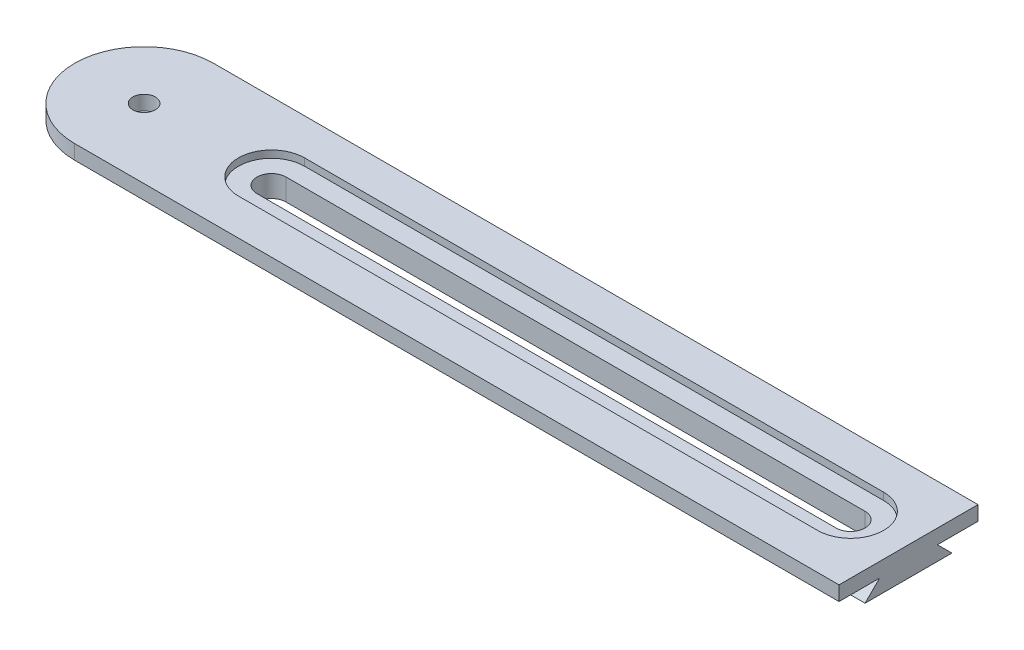
ISO-10303-21;
HEADER;
FILE_DESCRIPTION(('STEP AP214'),'2;1');
FILE_NAME('part.step','',(''),(''),'','','');
FILE_SCHEMA(('AUTOMOTIVE_DESIGN { 1 0 10303 214 1 1 1 1 }'));
ENDSEC;
DATA;
#1=APPLICATION_CONTEXT('core data for automotive mechanical design processes');
#2=APPLICATION_PROTOCOL_DEFINITION('international standard','automotive_design',2000,#1);
#3=PRODUCT_CONTEXT('',#1,'mechanical');
#4=PRODUCT('Part','Part','',(#3));
#5=PRODUCT_RELATED_PRODUCT_CATEGORY('part','',(#4));
#6=PRODUCT_DEFINITION_FORMATION('','',#4);
#7=PRODUCT_DEFINITION_CONTEXT('part definition',#1,'design');
#8=PRODUCT_DEFINITION('design','',#6,#7);
#9=PRODUCT_DEFINITION_SHAPE('','',#8);
#10=(LENGTH_UNIT() NAMED_UNIT(*) SI_UNIT(.MILLI.,.METRE.));
#11=(NAMED_UNIT(*) PLANE_ANGLE_UNIT() SI_UNIT($,.RADIAN.));
#12=(NAMED_UNIT(*) SI_UNIT($,.STERADIAN.) SOLID_ANGLE_UNIT());
#13=UNCERTAINTY_MEASURE_WITH_UNIT(LENGTH_MEASURE(1.E-05),#10,'distance_accuracy_value','');
#14=(GEOMETRIC_REPRESENTATION_CONTEXT(3) GLOBAL_UNCERTAINTY_ASSIGNED_CONTEXT((#13)) GLOBAL_UNIT_ASSIGNED_CONTEXT((#10,
#11,#12)) REPRESENTATION_CONTEXT('',''));
#15=CARTESIAN_POINT('',(0.,0.,0.));
#16=DIRECTION('',(0.,0.,1.));
#17=DIRECTION('',(1.,0.,0.));
#18=AXIS2_PLACEMENT_3D('',#15,#16,#17);
#19=CARTESIAN_POINT('',(0.,6.35,0.));
#20=DIRECTION('',(0.,-1.,0.));
#21=DIRECTION('',(0.,0.,-1.));
#22=AXIS2_PLACEMENT_3D('',#19,#20,#21);
#23=PLANE('',#22);
#24=DIRECTION('',(1.,0.,0.));
#25=VECTOR('',#24,1.);
#26=CARTESIAN_POINT('',(12.7,6.35,-7.986268));
#27=LINE('',#26,#25);
#28=CARTESIAN_POINT('',(12.7,6.35,-7.986268));
#29=VERTEX_POINT('',#28);
#30=CARTESIAN_POINT('',(139.7,6.35,-7.986268));
#31=VERTEX_POINT('',#30);
#32=EDGE_CURVE('E275',#29,#31,#27,.T.);
#33=ORIENTED_EDGE('',*,*,#32,.F.);
#34=CARTESIAN_POINT('',(12.7,6.35,-15.24));
#35=DIRECTION('',(0.,1.,0.));
#36=DIRECTION('',(0.,0.,1.));
#37=AXIS2_PLACEMENT_3D('',#34,#35,#36);
#38=CIRCLE('',#37,7.253732);
#39=CARTESIAN_POINT('',(12.7,6.35,-22.493732));
#40=VERTEX_POINT('',#39);
#41=EDGE_CURVE('E254',#40,#29,#38,.T.);
#42=ORIENTED_EDGE('',*,*,#41,.F.);
#43=DIRECTION('',(-1.,0.,0.));
#44=VECTOR('',#43,1.);
#45=CARTESIAN_POINT('',(12.7,6.35,-22.493732));
#46=LINE('',#45,#44);
#47=CARTESIAN_POINT('',(139.7,6.35,-22.493732));
#48=VERTEX_POINT('',#47);
#49=EDGE_CURVE('E260',#48,#40,#46,.T.);
#50=ORIENTED_EDGE('',*,*,#49,.F.);
#51=CARTESIAN_POINT('',(139.7,6.35,-15.24));
#52=DIRECTION('',(0.,1.,0.));
#53=DIRECTION('',(0.,0.,1.));
#54=AXIS2_PLACEMENT_3D('',#51,#52,#53);
#55=CIRCLE('',#54,7.253732);
#56=EDGE_CURVE('E279',#31,#48,#55,.T.);
#57=ORIENTED_EDGE('',*,*,#56,.F.);
#58=EDGE_LOOP('',(#33,#42,#50,#57));
#59=FACE_BOUND('',#58,.T.);
#60=DIRECTION('',(-1.,0.,0.));
#61=VECTOR('',#60,1.);
#62=CARTESIAN_POINT('',(0.,6.35,-30.48));
#63=LINE('',#62,#61);
#64=CARTESIAN_POINT('',(152.4,6.35,-30.48));
#65=VERTEX_POINT('',#64);
#66=CARTESIAN_POINT('',(-15.24,6.35,-30.48));
#67=VERTEX_POINT('',#66);
#68=EDGE_CURVE('E176',#65,#67,#63,.T.);
#69=ORIENTED_EDGE('',*,*,#68,.T.);
#70=CARTESIAN_POINT('',(-15.24,6.35,-15.24));
#71=DIRECTION('',(0.,1.,0.));
#72=DIRECTION('',(0.,0.,1.));
#73=AXIS2_PLACEMENT_3D('',#70,#71,#72);
#74=CIRCLE('',#73,15.24);
#75=CARTESIAN_POINT('',(-15.24,6.35,0.));
#76=VERTEX_POINT('',#75);
#77=EDGE_CURVE('E180',#67,#76,#74,.T.);
#78=ORIENTED_EDGE('',*,*,#77,.T.);
#79=DIRECTION('',(1.,0.,0.));
#80=VECTOR('',#79,1.);
#81=CARTESIAN_POINT('',(0.,6.35,0.));
#82=LINE('',#81,#80);
#83=CARTESIAN_POINT('',(152.4,6.35,0.));
#84=VERTEX_POINT('',#83);
#85=EDGE_CURVE('E339',#76,#84,#82,.T.);
#86=ORIENTED_EDGE('',*,*,#85,.T.);
#87=DIRECTION('',(0.,0.,-1.));
#88=VECTOR('',#87,1.);
#89=CARTESIAN_POINT('',(152.4,6.35,0.));
#90=LINE('',#89,#88);
#91=EDGE_CURVE('E182',#84,#65,#90,.T.);
#92=ORIENTED_EDGE('',*,*,#91,.T.);
#93=EDGE_LOOP('',(#69,#78,#86,#92));
#94=FACE_BOUND('',#93,.T.);
#95=CARTESIAN_POINT('',(-15.24,6.35,-15.24));
#96=DIRECTION('',(0.,1.,0.));
#97=DIRECTION('',(0.,0.,1.));
#98=AXIS2_PLACEMENT_3D('',#95,#96,#97);
#99=CIRCLE('',#98,2.45745);
#100=CARTESIAN_POINT('',(-15.24,6.35,-12.78255));
#101=VERTEX_POINT('',#100);
#102=EDGE_CURVE('E207',#101,#101,#99,.T.);
#103=ORIENTED_EDGE('',*,*,#102,.F.);
#104=EDGE_LOOP('',(#103));
#105=FACE_BOUND('',#104,.T.);
#106=ADVANCED_FACE('F48',(#59,#94,#105),#23,.F.);
#107=CARTESIAN_POINT('',(0.,0.,0.));
#108=DIRECTION('',(0.,-1.,0.));
#109=DIRECTION('',(0.,0.,-1.));
#110=AXIS2_PLACEMENT_3D('',#107,#108,#109);
#111=PLANE('',#110);
#112=CARTESIAN_POINT('',(12.7,0.,-15.24));
#113=DIRECTION('',(0.,1.,0.));
#114=DIRECTION('',(0.,0.,1.));
#115=AXIS2_PLACEMENT_3D('',#112,#113,#114);
#116=CIRCLE('',#115,3.175);
#117=CARTESIAN_POINT('',(12.7,0.,-18.415));
#118=VERTEX_POINT('',#117);
#119=CARTESIAN_POINT('',(12.7,0.,-12.065));
#120=VERTEX_POINT('',#119);
#121=EDGE_CURVE('E307',#118,#120,#116,.T.);
#122=ORIENTED_EDGE('',*,*,#121,.T.);
#123=DIRECTION('',(1.,0.,0.));
#124=VECTOR('',#123,1.);
#125=CARTESIAN_POINT('',(12.7,0.,-12.065));
#126=LINE('',#125,#124);
#127=CARTESIAN_POINT('',(139.7,0.,-12.065));
#128=VERTEX_POINT('',#127);
#129=EDGE_CURVE('E311',#120,#128,#126,.T.);
#130=ORIENTED_EDGE('',*,*,#129,.T.);
#131=CARTESIAN_POINT('',(139.7,0.,-15.24));
#132=DIRECTION('',(0.,1.,0.));
#133=DIRECTION('',(0.,0.,1.));
#134=AXIS2_PLACEMENT_3D('',#131,#132,#133);
#135=CIRCLE('',#134,3.175);
#136=CARTESIAN_POINT('',(139.7,0.,-18.415));
#137=VERTEX_POINT('',#136);
#138=EDGE_CURVE('E315',#128,#137,#135,.T.);
#139=ORIENTED_EDGE('',*,*,#138,.T.);
#140=DIRECTION('',(-1.,0.,0.));
#141=VECTOR('',#140,1.);
#142=CARTESIAN_POINT('',(12.7,0.,-18.415));
#143=LINE('',#142,#141);
#144=EDGE_CURVE('E319',#137,#118,#143,.T.);
#145=ORIENTED_EDGE('',*,*,#144,.T.);
#146=EDGE_LOOP('',(#122,#130,#139,#145));
#147=FACE_BOUND('',#146,.T.);
#148=DIRECTION('',(0.,0.,1.));
#149=VECTOR('',#148,1.);
#150=CARTESIAN_POINT('',(0.,0.,0.));
#151=LINE('',#150,#149);
#152=CARTESIAN_POINT('',(0.,0.,-24.765));
#153=VERTEX_POINT('',#152);
#154=CARTESIAN_POINT('',(0.,0.,-5.71499999999999));
#155=VERTEX_POINT('',#154);
#156=EDGE_CURVE('E73',#153,#155,#151,.T.);
#157=ORIENTED_EDGE('',*,*,#156,.F.);
#158=DIRECTION('',(-1.,0.,0.));
#159=VECTOR('',#158,1.);
#160=CARTESIAN_POINT('',(152.4,0.,-24.765));
#161=LINE('',#160,#159);
#162=CARTESIAN_POINT('',(152.4,0.,-24.765));
#163=VERTEX_POINT('',#162);
#164=EDGE_CURVE('E226',#163,#153,#161,.T.);
#165=ORIENTED_EDGE('',*,*,#164,.F.);
#166=DIRECTION('',(0.,0.,-1.));
#167=VECTOR('',#166,1.);
#168=CARTESIAN_POINT('',(152.4,0.,0.));
#169=LINE('',#168,#167);
#170=CARTESIAN_POINT('',(152.4,0.,-5.71499999999999));
#171=VERTEX_POINT('',#170);
#172=EDGE_CURVE('E342',#171,#163,#169,.T.);
#173=ORIENTED_EDGE('',*,*,#172,.F.);
#174=DIRECTION('',(-1.,0.,0.));
#175=VECTOR('',#174,1.);
#176=CARTESIAN_POINT('',(152.4,0.,-5.71499999999999));
#177=LINE('',#176,#175);
#178=EDGE_CURVE('E247',#171,#155,#177,.T.);
#179=ORIENTED_EDGE('',*,*,#178,.T.);
#180=EDGE_LOOP('',(#157,#165,#173,#179));
#181=FACE_BOUND('',#180,.T.);
#182=ADVANCED_FACE('F372',(#147,#181),#111,.T.);
#183=CARTESIAN_POINT('',(0.,6.35,0.));
#184=DIRECTION('',(1.,0.,0.));
#185=DIRECTION('',(0.,0.,-1.));
#186=AXIS2_PLACEMENT_3D('',#183,#184,#185);
#187=PLANE('',#186);
#188=DIRECTION('',(0.,-0.707106781186539,0.707106781186556));
#189=VECTOR('',#188,1.);
#190=CARTESIAN_POINT('',(0.,3.175,-8.89000000000006));
#191=LINE('',#190,#189);
#192=CARTESIAN_POINT('',(0.,3.17499999999998,-8.89000000000005));
#193=VERTEX_POINT('',#192);
#194=EDGE_CURVE('E233',#193,#155,#191,.T.);
#195=ORIENTED_EDGE('',*,*,#194,.F.);
#196=DIRECTION('',(0.,0.,-1.));
#197=VECTOR('',#196,1.);
#198=CARTESIAN_POINT('',(0.,3.17500000000003,-30.4799999999999));
#199=LINE('',#198,#197);
#200=CARTESIAN_POINT('',(0.,3.17500000000001,-21.5899999999999));
#201=VERTEX_POINT('',#200);
#202=EDGE_CURVE('E11',#193,#201,#199,.T.);
#203=ORIENTED_EDGE('',*,*,#202,.T.);
#204=DIRECTION('',(0.,-0.707106781186538,-0.707106781186557));
#205=VECTOR('',#204,1.);
#206=CARTESIAN_POINT('',(0.,3.17500000000001,-21.5899999999999));
#207=LINE('',#206,#205);
#208=EDGE_CURVE('E215',#201,#153,#207,.T.);
#209=ORIENTED_EDGE('',*,*,#208,.T.);
#210=ORIENTED_EDGE('',*,*,#156,.T.);
#211=EDGE_LOOP('',(#195,#203,#209,#210));
#212=FACE_BOUND('',#211,.T.);
#213=ADVANCED_FACE('F50',(#212),#187,.F.);
#214=CARTESIAN_POINT('',(0.,6.35,0.));
#215=DIRECTION('',(0.,0.,-1.));
#216=DIRECTION('',(-1.,0.,0.));
#217=AXIS2_PLACEMENT_3D('',#214,#215,#216);
#218=PLANE('',#217);
#219=DIRECTION('',(-1.,0.,0.));
#220=VECTOR('',#219,1.);
#221=CARTESIAN_POINT('',(152.4,3.175,0.));
#222=LINE('',#221,#220);
#223=CARTESIAN_POINT('',(152.4,3.175,0.));
#224=VERTEX_POINT('',#223);
#225=CARTESIAN_POINT('',(-15.24,3.17499999999994,0.));
#226=VERTEX_POINT('',#225);
#227=EDGE_CURVE('E251',#224,#226,#222,.T.);
#228=ORIENTED_EDGE('',*,*,#227,.F.);
#229=DIRECTION('',(0.,-1.,0.));
#230=VECTOR('',#229,1.);
#231=CARTESIAN_POINT('',(152.4,6.35,0.));
#232=LINE('',#231,#230);
#233=EDGE_CURVE('E351',#84,#224,#232,.T.);
#234=ORIENTED_EDGE('',*,*,#233,.F.);
#235=ORIENTED_EDGE('',*,*,#85,.F.);
#236=DIRECTION('',(0.,1.,0.));
#237=VECTOR('',#236,1.);
#238=CARTESIAN_POINT('',(-15.24,-39.9302293811319,0.));
#239=LINE('',#238,#237);
#240=EDGE_CURVE('E197',#226,#76,#239,.T.);
#241=ORIENTED_EDGE('',*,*,#240,.F.);
#242=EDGE_LOOP('',(#228,#234,#235,#241));
#243=FACE_BOUND('',#242,.T.);
#244=ADVANCED_FACE('F403',(#243),#218,.F.);
#245=CARTESIAN_POINT('',(152.4,6.35,0.));
#246=DIRECTION('',(-1.,0.,0.));
#247=DIRECTION('',(0.,0.,1.));
#248=AXIS2_PLACEMENT_3D('',#245,#246,#247);
#249=PLANE('',#248);
#250=DIRECTION('',(0.,-0.707106781186538,-0.707106781186557));
#251=VECTOR('',#250,1.);
#252=CARTESIAN_POINT('',(152.4,3.17500000000001,-21.5899999999999));
#253=LINE('',#252,#251);
#254=CARTESIAN_POINT('',(152.4,3.17500000000001,-21.5899999999999));
#255=VERTEX_POINT('',#254);
#256=EDGE_CURVE('E65',#255,#163,#253,.T.);
#257=ORIENTED_EDGE('',*,*,#256,.F.);
#258=DIRECTION('',(0.,0.,-1.));
#259=VECTOR('',#258,1.);
#260=CARTESIAN_POINT('',(152.4,3.17500000000001,-21.5899999999999));
#261=LINE('',#260,#259);
#262=CARTESIAN_POINT('',(152.4,3.17500000000003,-30.48));
#263=VERTEX_POINT('',#262);
#264=EDGE_CURVE('E216',#255,#263,#261,.T.);
#265=ORIENTED_EDGE('',*,*,#264,.T.);
#266=DIRECTION('',(0.,-1.,0.));
#267=VECTOR('',#266,1.);
#268=CARTESIAN_POINT('',(152.4,6.35,-30.48));
#269=LINE('',#268,#267);
#270=EDGE_CURVE('E187',#65,#263,#269,.T.);
#271=ORIENTED_EDGE('',*,*,#270,.F.);
#272=ORIENTED_EDGE('',*,*,#91,.F.);
#273=ORIENTED_EDGE('',*,*,#233,.T.);
#274=DIRECTION('',(0.,0.,1.));
#275=VECTOR('',#274,1.);
#276=CARTESIAN_POINT('',(152.4,3.175,-8.89000000000006));
#277=LINE('',#276,#275);
#278=CARTESIAN_POINT('',(152.4,3.175,-8.89000000000006));
#279=VERTEX_POINT('',#278);
#280=EDGE_CURVE('E234',#279,#224,#277,.T.);
#281=ORIENTED_EDGE('',*,*,#280,.F.);
#282=DIRECTION('',(0.,-0.707106781186539,0.707106781186556));
#283=VECTOR('',#282,1.);
#284=CARTESIAN_POINT('',(152.4,3.175,-8.89000000000006));
#285=LINE('',#284,#283);
#286=EDGE_CURVE('E237',#279,#171,#285,.T.);
#287=ORIENTED_EDGE('',*,*,#286,.T.);
#288=ORIENTED_EDGE('',*,*,#172,.T.);
#289=EDGE_LOOP('',(#257,#265,#271,#272,#273,#281,#287,#288));
#290=FACE_BOUND('',#289,.T.);
#291=ADVANCED_FACE('F401',(#290),#249,.F.);
#292=CARTESIAN_POINT('',(12.7,0.,-15.24));
#293=DIRECTION('',(0.,1.,0.));
#294=DIRECTION('',(0.,0.,1.));
#295=AXIS2_PLACEMENT_3D('',#292,#293,#294);
#296=CYLINDRICAL_SURFACE('',#295,3.175);
#297=CARTESIAN_POINT('',(12.7,4.7625,-15.24));
#298=DIRECTION('',(0.,1.,0.));
#299=DIRECTION('',(0.,0.,1.));
#300=AXIS2_PLACEMENT_3D('',#297,#298,#299);
#301=CIRCLE('',#300,3.175);
#302=CARTESIAN_POINT('',(12.7,4.7625,-12.065));
#303=VERTEX_POINT('',#302);
#304=CARTESIAN_POINT('',(12.7,4.7625,-18.415));
#305=VERTEX_POINT('',#304);
#306=EDGE_CURVE('E304',#303,#305,#301,.F.);
#307=ORIENTED_EDGE('',*,*,#306,.F.);
#308=DIRECTION('',(0.,1.,0.));
#309=VECTOR('',#308,1.);
#310=CARTESIAN_POINT('',(12.7,0.,-12.065));
#311=LINE('',#310,#309);
#312=EDGE_CURVE('E323',#120,#303,#311,.T.);
#313=ORIENTED_EDGE('',*,*,#312,.F.);
#314=ORIENTED_EDGE('',*,*,#121,.F.);
#315=DIRECTION('',(0.,1.,0.));
#316=VECTOR('',#315,1.);
#317=CARTESIAN_POINT('',(12.7,0.,-18.415));
#318=LINE('',#317,#316);
#319=EDGE_CURVE('E324',#118,#305,#318,.T.);
#320=ORIENTED_EDGE('',*,*,#319,.T.);
#321=EDGE_LOOP('',(#307,#313,#314,#320));
#322=FACE_BOUND('',#321,.T.);
#323=ADVANCED_FACE('F367',(#322),#296,.F.);
#324=CARTESIAN_POINT('',(12.7,0.,-18.415));
#325=DIRECTION('',(0.,0.,-1.));
#326=DIRECTION('',(-1.,0.,0.));
#327=AXIS2_PLACEMENT_3D('',#324,#325,#326);
#328=PLANE('',#327);
#329=DIRECTION('',(1.,0.,0.));
#330=VECTOR('',#329,1.);
#331=CARTESIAN_POINT('',(12.7,4.7625,-18.415));
#332=LINE('',#331,#330);
#333=CARTESIAN_POINT('',(139.7,4.7625,-18.415));
#334=VERTEX_POINT('',#333);
#335=EDGE_CURVE('E301',#305,#334,#332,.T.);
#336=ORIENTED_EDGE('',*,*,#335,.F.);
#337=ORIENTED_EDGE('',*,*,#319,.F.);
#338=ORIENTED_EDGE('',*,*,#144,.F.);
#339=DIRECTION('',(0.,1.,0.));
#340=VECTOR('',#339,1.);
#341=CARTESIAN_POINT('',(139.7,0.,-18.415));
#342=LINE('',#341,#340);
#343=EDGE_CURVE('E328',#137,#334,#342,.T.);
#344=ORIENTED_EDGE('',*,*,#343,.T.);
#345=EDGE_LOOP('',(#336,#337,#338,#344));
#346=FACE_BOUND('',#345,.T.);
#347=ADVANCED_FACE('F376',(#346),#328,.F.);
#348=CARTESIAN_POINT('',(139.7,0.,-15.24));
#349=DIRECTION('',(0.,1.,0.));
#350=DIRECTION('',(0.,0.,1.));
#351=AXIS2_PLACEMENT_3D('',#348,#349,#350);
#352=CYLINDRICAL_SURFACE('',#351,3.175);
#353=CARTESIAN_POINT('',(139.7,4.7625,-15.24));
#354=DIRECTION('',(0.,1.,0.));
#355=DIRECTION('',(0.,0.,1.));
#356=AXIS2_PLACEMENT_3D('',#353,#354,#355);
#357=CIRCLE('',#356,3.175);
#358=CARTESIAN_POINT('',(139.7,4.7625,-12.065));
#359=VERTEX_POINT('',#358);
#360=EDGE_CURVE('E289',#334,#359,#357,.F.);
#361=ORIENTED_EDGE('',*,*,#360,.F.);
#362=ORIENTED_EDGE('',*,*,#343,.F.);
#363=ORIENTED_EDGE('',*,*,#138,.F.);
#364=DIRECTION('',(0.,1.,0.));
#365=VECTOR('',#364,1.);
#366=CARTESIAN_POINT('',(139.7,0.,-12.065));
#367=LINE('',#366,#365);
#368=EDGE_CURVE('E332',#128,#359,#367,.T.);
#369=ORIENTED_EDGE('',*,*,#368,.T.);
#370=EDGE_LOOP('',(#361,#362,#363,#369));
#371=FACE_BOUND('',#370,.T.);
#372=ADVANCED_FACE('F378',(#371),#352,.F.);
#373=CARTESIAN_POINT('',(12.7,0.,-12.065));
#374=DIRECTION('',(0.,0.,1.));
#375=DIRECTION('',(1.,0.,0.));
#376=AXIS2_PLACEMENT_3D('',#373,#374,#375);
#377=PLANE('',#376);
#378=DIRECTION('',(-1.,0.,0.));
#379=VECTOR('',#378,1.);
#380=CARTESIAN_POINT('',(12.7,4.7625,-12.065));
#381=LINE('',#380,#379);
#382=EDGE_CURVE('E52',#359,#303,#381,.T.);
#383=ORIENTED_EDGE('',*,*,#382,.F.);
#384=ORIENTED_EDGE('',*,*,#368,.F.);
#385=ORIENTED_EDGE('',*,*,#129,.F.);
#386=ORIENTED_EDGE('',*,*,#312,.T.);
#387=EDGE_LOOP('',(#383,#384,#385,#386));
#388=FACE_BOUND('',#387,.T.);
#389=ADVANCED_FACE('F370',(#388),#377,.F.);
#390=CARTESIAN_POINT('',(0.,6.35,-30.48));
#391=DIRECTION('',(0.,0.,1.));
#392=DIRECTION('',(1.,0.,0.));
#393=AXIS2_PLACEMENT_3D('',#390,#391,#392);
#394=PLANE('',#393);
#395=ORIENTED_EDGE('',*,*,#270,.T.);
#396=DIRECTION('',(-1.,0.,0.));
#397=VECTOR('',#396,1.);
#398=CARTESIAN_POINT('',(152.4,3.17500000000003,-30.48));
#399=LINE('',#398,#397);
#400=CARTESIAN_POINT('',(-15.24,3.17500000000002,-30.48));
#401=VERTEX_POINT('',#400);
#402=EDGE_CURVE('E192',#263,#401,#399,.T.);
#403=ORIENTED_EDGE('',*,*,#402,.T.);
#404=DIRECTION('',(0.,1.,0.));
#405=VECTOR('',#404,1.);
#406=CARTESIAN_POINT('',(-15.24,-39.9302293811319,-30.48));
#407=LINE('',#406,#405);
#408=EDGE_CURVE('E190',#401,#67,#407,.T.);
#409=ORIENTED_EDGE('',*,*,#408,.T.);
#410=ORIENTED_EDGE('',*,*,#68,.F.);
#411=EDGE_LOOP('',(#395,#403,#409,#410));
#412=FACE_BOUND('',#411,.T.);
#413=ADVANCED_FACE('F191',(#412),#394,.F.);
#414=CARTESIAN_POINT('',(12.7,4.7625,-15.24));
#415=DIRECTION('',(0.,1.,0.));
#416=DIRECTION('',(0.,0.,1.));
#417=AXIS2_PLACEMENT_3D('',#414,#415,#416);
#418=PLANE('',#417);
#419=CARTESIAN_POINT('',(12.7,4.7625,-15.24));
#420=DIRECTION('',(0.,1.,0.));
#421=DIRECTION('',(0.,0.,1.));
#422=AXIS2_PLACEMENT_3D('',#419,#420,#421);
#423=CIRCLE('',#422,7.253732);
#424=CARTESIAN_POINT('',(12.7,4.7625,-22.493732));
#425=VERTEX_POINT('',#424);
#426=CARTESIAN_POINT('',(12.7,4.7625,-7.986268));
#427=VERTEX_POINT('',#426);
#428=EDGE_CURVE('E255',#425,#427,#423,.T.);
#429=ORIENTED_EDGE('',*,*,#428,.T.);
#430=DIRECTION('',(1.,0.,0.));
#431=VECTOR('',#430,1.);
#432=CARTESIAN_POINT('',(12.7,4.7625,-7.986268));
#433=LINE('',#432,#431);
#434=CARTESIAN_POINT('',(139.7,4.7625,-7.986268));
#435=VERTEX_POINT('',#434);
#436=EDGE_CURVE('E259',#427,#435,#433,.T.);
#437=ORIENTED_EDGE('',*,*,#436,.T.);
#438=CARTESIAN_POINT('',(139.7,4.7625,-15.24));
#439=DIRECTION('',(0.,1.,0.));
#440=DIRECTION('',(0.,0.,1.));
#441=AXIS2_PLACEMENT_3D('',#438,#439,#440);
#442=CIRCLE('',#441,7.253732);
#443=CARTESIAN_POINT('',(139.7,4.7625,-22.493732));
#444=VERTEX_POINT('',#443);
#445=EDGE_CURVE('E264',#435,#444,#442,.T.);
#446=ORIENTED_EDGE('',*,*,#445,.T.);
#447=DIRECTION('',(-1.,0.,0.));
#448=VECTOR('',#447,1.);
#449=CARTESIAN_POINT('',(12.7,4.7625,-22.493732));
#450=LINE('',#449,#448);
#451=EDGE_CURVE('E268',#444,#425,#450,.T.);
#452=ORIENTED_EDGE('',*,*,#451,.T.);
#453=EDGE_LOOP('',(#429,#437,#446,#452));
#454=FACE_BOUND('',#453,.T.);
#455=ORIENTED_EDGE('',*,*,#306,.T.);
#456=ORIENTED_EDGE('',*,*,#335,.T.);
#457=ORIENTED_EDGE('',*,*,#360,.T.);
#458=ORIENTED_EDGE('',*,*,#382,.T.);
#459=EDGE_LOOP('',(#455,#456,#457,#458));
#460=FACE_BOUND('',#459,.T.);
#461=ADVANCED_FACE('F361',(#454,#460),#418,.T.);
#462=CARTESIAN_POINT('',(12.7,4.7625,-15.24));
#463=DIRECTION('',(0.,1.,0.));
#464=DIRECTION('',(0.,0.,1.));
#465=AXIS2_PLACEMENT_3D('',#462,#463,#464);
#466=CYLINDRICAL_SURFACE('',#465,7.253732);
#467=ORIENTED_EDGE('',*,*,#41,.T.);
#468=DIRECTION('',(0.,1.,0.));
#469=VECTOR('',#468,1.);
#470=CARTESIAN_POINT('',(12.7,4.7625,-7.986268));
#471=LINE('',#470,#469);
#472=EDGE_CURVE('E272',#427,#29,#471,.T.);
#473=ORIENTED_EDGE('',*,*,#472,.F.);
#474=ORIENTED_EDGE('',*,*,#428,.F.);
#475=DIRECTION('',(0.,1.,0.));
#476=VECTOR('',#475,1.);
#477=CARTESIAN_POINT('',(12.7,4.7625,-22.493732));
#478=LINE('',#477,#476);
#479=EDGE_CURVE('E286',#425,#40,#478,.T.);
#480=ORIENTED_EDGE('',*,*,#479,.T.);
#481=EDGE_LOOP('',(#467,#473,#474,#480));
#482=FACE_BOUND('',#481,.T.);
#483=ADVANCED_FACE('F432',(#482),#466,.F.);
#484=CARTESIAN_POINT('',(12.7,4.7625,-22.493732));
#485=DIRECTION('',(0.,0.,-1.));
#486=DIRECTION('',(-1.,0.,0.));
#487=AXIS2_PLACEMENT_3D('',#484,#485,#486);
#488=PLANE('',#487);
#489=ORIENTED_EDGE('',*,*,#49,.T.);
#490=ORIENTED_EDGE('',*,*,#479,.F.);
#491=ORIENTED_EDGE('',*,*,#451,.F.);
#492=DIRECTION('',(0.,1.,0.));
#493=VECTOR('',#492,1.);
#494=CARTESIAN_POINT('',(139.7,4.7625,-22.493732));
#495=LINE('',#494,#493);
#496=EDGE_CURVE('E290',#444,#48,#495,.T.);
#497=ORIENTED_EDGE('',*,*,#496,.T.);
#498=EDGE_LOOP('',(#489,#490,#491,#497));
#499=FACE_BOUND('',#498,.T.);
#500=ADVANCED_FACE('F434',(#499),#488,.F.);
#501=CARTESIAN_POINT('',(139.7,4.7625,-15.24));
#502=DIRECTION('',(0.,1.,0.));
#503=DIRECTION('',(0.,0.,1.));
#504=AXIS2_PLACEMENT_3D('',#501,#502,#503);
#505=CYLINDRICAL_SURFACE('',#504,7.253732);
#506=ORIENTED_EDGE('',*,*,#56,.T.);
#507=ORIENTED_EDGE('',*,*,#496,.F.);
#508=ORIENTED_EDGE('',*,*,#445,.F.);
#509=DIRECTION('',(0.,1.,0.));
#510=VECTOR('',#509,1.);
#511=CARTESIAN_POINT('',(139.7,4.7625,-7.986268));
#512=LINE('',#511,#510);
#513=EDGE_CURVE('E293',#435,#31,#512,.T.);
#514=ORIENTED_EDGE('',*,*,#513,.T.);
#515=EDGE_LOOP('',(#506,#507,#508,#514));
#516=FACE_BOUND('',#515,.T.);
#517=ADVANCED_FACE('F437',(#516),#505,.F.);
#518=CARTESIAN_POINT('',(12.7,4.7625,-7.986268));
#519=DIRECTION('',(0.,0.,1.));
#520=DIRECTION('',(1.,0.,0.));
#521=AXIS2_PLACEMENT_3D('',#518,#519,#520);
#522=PLANE('',#521);
#523=ORIENTED_EDGE('',*,*,#32,.T.);
#524=ORIENTED_EDGE('',*,*,#513,.F.);
#525=ORIENTED_EDGE('',*,*,#436,.F.);
#526=ORIENTED_EDGE('',*,*,#472,.T.);
#527=EDGE_LOOP('',(#523,#524,#525,#526));
#528=FACE_BOUND('',#527,.T.);
#529=ADVANCED_FACE('F425',(#528),#522,.F.);
#530=CARTESIAN_POINT('',(152.4,3.175,-8.89000000000006));
#531=DIRECTION('',(0.,-1.,0.));
#532=DIRECTION('',(0.,0.,-1.));
#533=AXIS2_PLACEMENT_3D('',#530,#531,#532);
#534=PLANE('',#533);
#535=CARTESIAN_POINT('',(-15.24,3.175,-15.24));
#536=DIRECTION('',(0.,-1.,0.));
#537=DIRECTION('',(0.,0.,-1.));
#538=AXIS2_PLACEMENT_3D('',#535,#536,#537);
#539=CIRCLE('',#538,2.45745);
#540=CARTESIAN_POINT('',(-15.24,3.175,-17.69745));
#541=VERTEX_POINT('',#540);
#542=EDGE_CURVE('E203',#541,#541,#539,.T.);
#543=ORIENTED_EDGE('',*,*,#542,.F.);
#544=EDGE_LOOP('',(#543));
#545=FACE_BOUND('',#544,.T.);
#546=ORIENTED_EDGE('',*,*,#227,.T.);
#547=CARTESIAN_POINT('',(-15.24,3.17499999999999,-15.24));
#548=DIRECTION('',(0.,1.,0.));
#549=DIRECTION('',(0.,0.,1.));
#550=AXIS2_PLACEMENT_3D('',#547,#548,#549);
#551=CIRCLE('',#550,15.24);
#552=EDGE_CURVE('E211',#226,#401,#551,.F.);
#553=ORIENTED_EDGE('',*,*,#552,.T.);
#554=ORIENTED_EDGE('',*,*,#402,.F.);
#555=ORIENTED_EDGE('',*,*,#264,.F.);
#556=DIRECTION('',(-1.,0.,0.));
#557=VECTOR('',#556,1.);
#558=CARTESIAN_POINT('',(152.4,3.17500000000001,-21.5899999999999));
#559=LINE('',#558,#557);
#560=EDGE_CURVE('E229',#255,#201,#559,.T.);
#561=ORIENTED_EDGE('',*,*,#560,.T.);
#562=ORIENTED_EDGE('',*,*,#202,.F.);
#563=DIRECTION('',(-1.,0.,0.));
#564=VECTOR('',#563,1.);
#565=CARTESIAN_POINT('',(152.4,3.175,-8.89000000000006));
#566=LINE('',#565,#564);
#567=EDGE_CURVE('E241',#279,#193,#566,.T.);
#568=ORIENTED_EDGE('',*,*,#567,.F.);
#569=ORIENTED_EDGE('',*,*,#280,.T.);
#570=EDGE_LOOP('',(#546,#553,#554,#555,#561,#562,#568,#569));
#571=FACE_BOUND('',#570,.T.);
#572=ADVANCED_FACE('F411',(#545,#571),#534,.T.);
#573=CARTESIAN_POINT('',(152.4,3.175,-8.89000000000006));
#574=DIRECTION('',(0.,-0.707106781186556,-0.707106781186539));
#575=DIRECTION('',(0.,0.707106781186539,-0.707106781186556));
#576=AXIS2_PLACEMENT_3D('',#573,#574,#575);
#577=PLANE('',#576);
#578=ORIENTED_EDGE('',*,*,#194,.T.);
#579=ORIENTED_EDGE('',*,*,#178,.F.);
#580=ORIENTED_EDGE('',*,*,#286,.F.);
#581=ORIENTED_EDGE('',*,*,#567,.T.);
#582=EDGE_LOOP('',(#578,#579,#580,#581));
#583=FACE_BOUND('',#582,.T.);
#584=ADVANCED_FACE('F418',(#583),#577,.F.);
#585=CARTESIAN_POINT('',(152.4,3.17500000000001,-21.5899999999999));
#586=DIRECTION('',(0.,0.707106781186557,-0.707106781186538));
#587=DIRECTION('',(0.,0.707106781186538,0.707106781186557));
#588=AXIS2_PLACEMENT_3D('',#585,#586,#587);
#589=PLANE('',#588);
#590=ORIENTED_EDGE('',*,*,#208,.F.);
#591=ORIENTED_EDGE('',*,*,#560,.F.);
#592=ORIENTED_EDGE('',*,*,#256,.T.);
#593=ORIENTED_EDGE('',*,*,#164,.T.);
#594=EDGE_LOOP('',(#590,#591,#592,#593));
#595=FACE_BOUND('',#594,.T.);
#596=ADVANCED_FACE('F416',(#595),#589,.T.);
#597=CARTESIAN_POINT('',(-15.24,-39.9302293811319,-15.24));
#598=DIRECTION('',(0.,1.,0.));
#599=DIRECTION('',(0.,0.,1.));
#600=AXIS2_PLACEMENT_3D('',#597,#598,#599);
#601=CYLINDRICAL_SURFACE('',#600,15.24);
#602=ORIENTED_EDGE('',*,*,#552,.F.);
#603=ORIENTED_EDGE('',*,*,#240,.T.);
#604=ORIENTED_EDGE('',*,*,#77,.F.);
#605=ORIENTED_EDGE('',*,*,#408,.F.);
#606=EDGE_LOOP('',(#602,#603,#604,#605));
#607=FACE_BOUND('',#606,.T.);
#608=ADVANCED_FACE('F200',(#607),#601,.T.);
#609=CARTESIAN_POINT('',(-15.24,6.35,-15.24));
#610=DIRECTION('',(0.,1.,0.));
#611=DIRECTION('',(0.,0.,1.));
#612=AXIS2_PLACEMENT_3D('',#609,#610,#611);
#613=CYLINDRICAL_SURFACE('',#612,2.45745);
#614=ORIENTED_EDGE('',*,*,#102,.T.);
#615=EDGE_LOOP('',(#614));
#616=FACE_BOUND('',#615,.T.);
#617=ORIENTED_EDGE('',*,*,#542,.T.);
#618=EDGE_LOOP('',(#617));
#619=FACE_BOUND('',#618,.T.);
#620=ADVANCED_FACE('F565',(#616,#619),#613,.F.);
#621=CLOSED_SHELL('',(#106,#182,#213,#244,#291,#323,#347,#372,#389,#413,#461,#483,#500,#517,
#529,#572,#584,#596,#608,#620));
#622=MANIFOLD_SOLID_BREP('B2',#621);
#623=ADVANCED_BREP_SHAPE_REPRESENTATION('',(#18,#622),#14);
#624=SHAPE_DEFINITION_REPRESENTATION(#9,#623);
ENDSEC;
END-ISO-10303-21;
